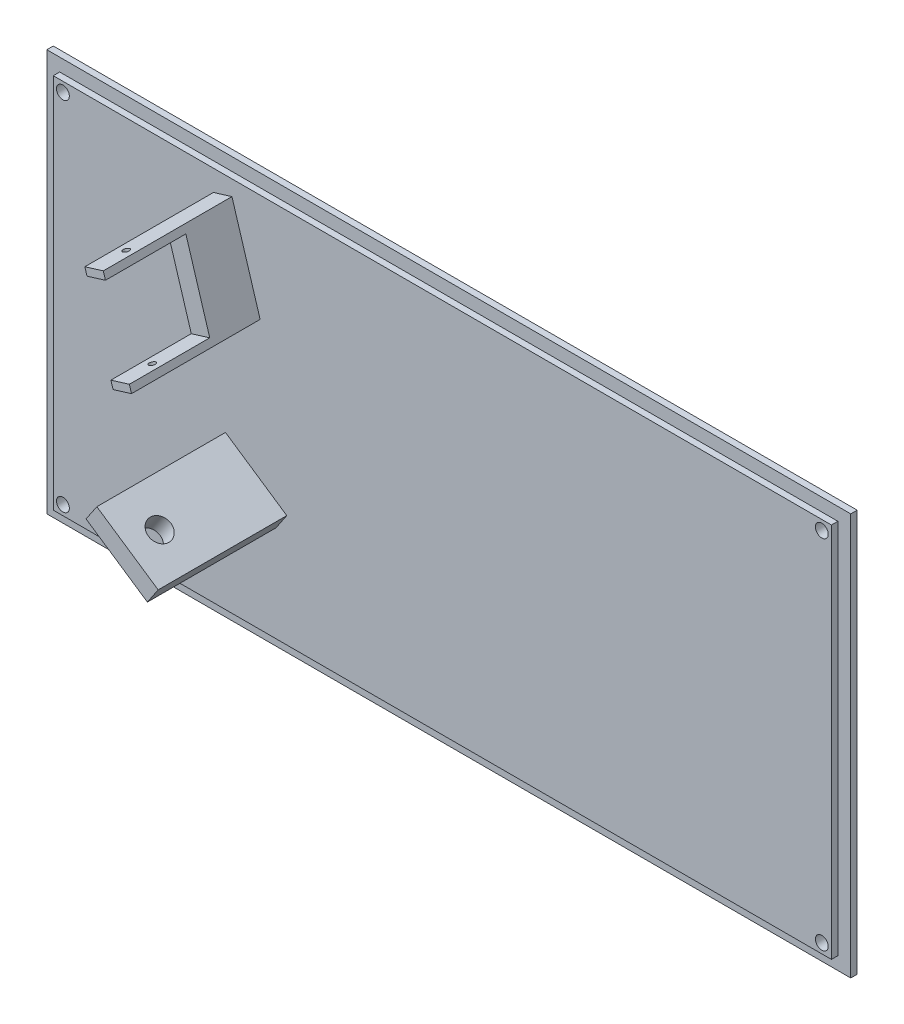
ISO-10303-21;
HEADER;
FILE_DESCRIPTION(('STEP AP214'),'2;1');
FILE_NAME('part.step','',(''),(''),'','','');
FILE_SCHEMA(('AUTOMOTIVE_DESIGN { 1 0 10303 214 1 1 1 1 }'));
ENDSEC;
DATA;
#1=APPLICATION_CONTEXT('core data for automotive mechanical design processes');
#2=APPLICATION_PROTOCOL_DEFINITION('international standard','automotive_design',2000,#1);
#3=PRODUCT_CONTEXT('',#1,'mechanical');
#4=PRODUCT('Part','Part','',(#3));
#5=PRODUCT_RELATED_PRODUCT_CATEGORY('part','',(#4));
#6=PRODUCT_DEFINITION_FORMATION('','',#4);
#7=PRODUCT_DEFINITION_CONTEXT('part definition',#1,'design');
#8=PRODUCT_DEFINITION('design','',#6,#7);
#9=PRODUCT_DEFINITION_SHAPE('','',#8);
#10=(LENGTH_UNIT() NAMED_UNIT(*) SI_UNIT(.MILLI.,.METRE.));
#11=(NAMED_UNIT(*) PLANE_ANGLE_UNIT() SI_UNIT($,.RADIAN.));
#12=(NAMED_UNIT(*) SI_UNIT($,.STERADIAN.) SOLID_ANGLE_UNIT());
#13=UNCERTAINTY_MEASURE_WITH_UNIT(LENGTH_MEASURE(1.E-05),#10,'distance_accuracy_value','');
#14=(GEOMETRIC_REPRESENTATION_CONTEXT(3) GLOBAL_UNCERTAINTY_ASSIGNED_CONTEXT((#13)) GLOBAL_UNIT_ASSIGNED_CONTEXT((#10,
#11,#12)) REPRESENTATION_CONTEXT('',''));
#15=CARTESIAN_POINT('',(0.,0.,0.));
#16=DIRECTION('',(0.,0.,1.));
#17=DIRECTION('',(1.,0.,0.));
#18=AXIS2_PLACEMENT_3D('',#15,#16,#17);
#19=CARTESIAN_POINT('',(0.,0.,44.));
#20=DIRECTION('',(0.,0.,-1.));
#21=DIRECTION('',(-1.,0.,0.));
#22=AXIS2_PLACEMENT_3D('',#19,#20,#21);
#23=PLANE('',#22);
#24=DIRECTION('',(0.292371704722737,-0.956304755963035,0.));
#25=VECTOR('',#24,1.);
#26=CARTESIAN_POINT('',(62.5952585906923,85.7783135463862,44.));
#27=LINE('',#26,#25);
#28=CARTESIAN_POINT('',(53.8241074490102,114.467456225277,44.));
#29=VERTEX_POINT('',#28);
#30=CARTESIAN_POINT('',(54.4965623698724,112.267955286562,44.));
#31=VERTEX_POINT('',#30);
#32=EDGE_CURVE('E227',#29,#31,#27,.T.);
#33=ORIENTED_EDGE('',*,*,#32,.T.);
#34=DIRECTION('',(-0.956304755963035,-0.292371704722738,0.));
#35=VECTOR('',#34,1.);
#36=CARTESIAN_POINT('',(54.4965623698724,112.267955286562,44.));
#37=LINE('',#36,#35);
#38=CARTESIAN_POINT('',(60.2343909056507,114.022185514899,44.));
#39=VERTEX_POINT('',#38);
#40=EDGE_CURVE('E186',#39,#31,#37,.T.);
#41=ORIENTED_EDGE('',*,*,#40,.F.);
#42=DIRECTION('',(-0.292371704722737,0.956304755963035,0.));
#43=VECTOR('',#42,1.);
#44=CARTESIAN_POINT('',(68.3330871264705,87.5325437747227,44.));
#45=LINE('',#44,#43);
#46=CARTESIAN_POINT('',(59.5619359847884,116.221686453614,44.));
#47=VERTEX_POINT('',#46);
#48=EDGE_CURVE('E232',#39,#47,#45,.T.);
#49=ORIENTED_EDGE('',*,*,#48,.T.);
#50=DIRECTION('',(-0.956304755963035,-0.292371704722737,0.));
#51=VECTOR('',#50,1.);
#52=CARTESIAN_POINT('',(53.8241074490102,114.467456225277,44.));
#53=LINE('',#52,#51);
#54=EDGE_CURVE('E236',#47,#29,#53,.T.);
#55=ORIENTED_EDGE('',*,*,#54,.T.);
#56=EDGE_LOOP('',(#33,#41,#49,#55));
#57=FACE_BOUND('',#56,.T.);
#58=ADVANCED_FACE('F33',(#57),#23,.F.);
#59=CARTESIAN_POINT('',(0.,0.,4.));
#60=DIRECTION('',(0.,0.,1.));
#61=DIRECTION('',(1.,0.,0.));
#62=AXIS2_PLACEMENT_3D('',#59,#60,#61);
#63=PLANE('',#62);
#64=CARTESIAN_POINT('',(243.,118.,4.));
#65=DIRECTION('',(0.,0.,1.));
#66=DIRECTION('',(1.,0.,0.));
#67=AXIS2_PLACEMENT_3D('',#64,#65,#66);
#68=CIRCLE('',#67,2.);
#69=CARTESIAN_POINT('',(245.,118.,4.));
#70=VERTEX_POINT('',#69);
#71=EDGE_CURVE('E257',#70,#70,#68,.T.);
#72=ORIENTED_EDGE('',*,*,#71,.F.);
#73=EDGE_LOOP('',(#72));
#74=FACE_BOUND('',#73,.T.);
#75=CARTESIAN_POINT('',(243.,7.,4.));
#76=DIRECTION('',(0.,0.,1.));
#77=DIRECTION('',(1.,0.,0.));
#78=AXIS2_PLACEMENT_3D('',#75,#76,#77);
#79=CIRCLE('',#78,2.);
#80=CARTESIAN_POINT('',(245.,7.,4.));
#81=VERTEX_POINT('',#80);
#82=EDGE_CURVE('E262',#81,#81,#79,.T.);
#83=ORIENTED_EDGE('',*,*,#82,.F.);
#84=EDGE_LOOP('',(#83));
#85=FACE_BOUND('',#84,.T.);
#86=CARTESIAN_POINT('',(7.,7.00000000000001,4.));
#87=DIRECTION('',(0.,0.,1.));
#88=DIRECTION('',(1.,0.,0.));
#89=AXIS2_PLACEMENT_3D('',#86,#87,#88);
#90=CIRCLE('',#89,2.);
#91=CARTESIAN_POINT('',(9.,7.00000000000001,4.));
#92=VERTEX_POINT('',#91);
#93=EDGE_CURVE('E258',#92,#92,#90,.T.);
#94=ORIENTED_EDGE('',*,*,#93,.F.);
#95=EDGE_LOOP('',(#94));
#96=FACE_BOUND('',#95,.T.);
#97=CARTESIAN_POINT('',(7.,118.,4.));
#98=DIRECTION('',(0.,0.,1.));
#99=DIRECTION('',(1.,0.,0.));
#100=AXIS2_PLACEMENT_3D('',#97,#98,#99);
#101=CIRCLE('',#100,2.);
#102=CARTESIAN_POINT('',(9.,118.,4.));
#103=VERTEX_POINT('',#102);
#104=EDGE_CURVE('E261',#103,#103,#101,.T.);
#105=ORIENTED_EDGE('',*,*,#104,.F.);
#106=EDGE_LOOP('',(#105));
#107=FACE_BOUND('',#106,.T.);
#108=DIRECTION('',(0.,-1.,0.));
#109=VECTOR('',#108,1.);
#110=CARTESIAN_POINT('',(4.,121.,4.));
#111=LINE('',#110,#109);
#112=CARTESIAN_POINT('',(4.,121.,4.));
#113=VERTEX_POINT('',#112);
#114=CARTESIAN_POINT('',(4.00000000000002,4.,4.));
#115=VERTEX_POINT('',#114);
#116=EDGE_CURVE('E282',#113,#115,#111,.T.);
#117=ORIENTED_EDGE('',*,*,#116,.T.);
#118=DIRECTION('',(1.,0.,0.));
#119=VECTOR('',#118,1.);
#120=CARTESIAN_POINT('',(4.00000000000002,4.,4.));
#121=LINE('',#120,#119);
#122=CARTESIAN_POINT('',(246.,4.,4.));
#123=VERTEX_POINT('',#122);
#124=EDGE_CURVE('E285',#115,#123,#121,.T.);
#125=ORIENTED_EDGE('',*,*,#124,.T.);
#126=DIRECTION('',(0.,1.,0.));
#127=VECTOR('',#126,1.);
#128=CARTESIAN_POINT('',(246.,121.,4.));
#129=LINE('',#128,#127);
#130=CARTESIAN_POINT('',(246.,121.,4.));
#131=VERTEX_POINT('',#130);
#132=EDGE_CURVE('E288',#123,#131,#129,.T.);
#133=ORIENTED_EDGE('',*,*,#132,.T.);
#134=DIRECTION('',(-1.,0.,0.));
#135=VECTOR('',#134,1.);
#136=CARTESIAN_POINT('',(4.,121.,4.));
#137=LINE('',#136,#135);
#138=EDGE_CURVE('E290',#131,#113,#137,.T.);
#139=ORIENTED_EDGE('',*,*,#138,.T.);
#140=EDGE_LOOP('',(#117,#125,#133,#139));
#141=FACE_BOUND('',#140,.T.);
#142=DIRECTION('',(0.956304755963035,0.292371704722738,0.));
#143=VECTOR('',#142,1.);
#144=CARTESIAN_POINT('',(62.5952585906923,85.7783135463862,4.));
#145=LINE('',#144,#143);
#146=CARTESIAN_POINT('',(62.5952585906923,85.7783135463862,4.));
#147=VERTEX_POINT('',#146);
#148=CARTESIAN_POINT('',(68.3330871264705,87.5325437747227,4.));
#149=VERTEX_POINT('',#148);
#150=EDGE_CURVE('E241',#147,#149,#145,.T.);
#151=ORIENTED_EDGE('',*,*,#150,.F.);
#152=DIRECTION('',(0.292371704722737,-0.956304755963035,0.));
#153=VECTOR('',#152,1.);
#154=CARTESIAN_POINT('',(62.5952585906923,85.7783135463862,4.));
#155=LINE('',#154,#153);
#156=CARTESIAN_POINT('',(53.8241074490102,114.467456225277,4.));
#157=VERTEX_POINT('',#156);
#158=EDGE_CURVE('E226',#157,#147,#155,.T.);
#159=ORIENTED_EDGE('',*,*,#158,.F.);
#160=DIRECTION('',(-0.956304755963035,-0.292371704722737,0.));
#161=VECTOR('',#160,1.);
#162=CARTESIAN_POINT('',(53.8241074490102,114.467456225277,4.));
#163=LINE('',#162,#161);
#164=CARTESIAN_POINT('',(59.5619359847884,116.221686453614,4.));
#165=VERTEX_POINT('',#164);
#166=EDGE_CURVE('E246',#165,#157,#163,.T.);
#167=ORIENTED_EDGE('',*,*,#166,.F.);
#168=DIRECTION('',(-0.292371704722737,0.956304755963035,0.));
#169=VECTOR('',#168,1.);
#170=CARTESIAN_POINT('',(68.3330871264705,87.5325437747227,4.));
#171=LINE('',#170,#169);
#172=EDGE_CURVE('E243',#149,#165,#171,.T.);
#173=ORIENTED_EDGE('',*,*,#172,.F.);
#174=EDGE_LOOP('',(#151,#159,#167,#173));
#175=FACE_BOUND('',#174,.T.);
#176=DIRECTION('',(0.829037572555041,-0.559192903470748,0.));
#177=VECTOR('',#176,1.);
#178=CARTESIAN_POINT('',(54.2005600012169,46.7325639564784,4.));
#179=LINE('',#178,#177);
#180=CARTESIAN_POINT('',(54.2005600012169,46.7325639564784,4.));
#181=VERTEX_POINT('',#180);
#182=CARTESIAN_POINT('',(73.2684241699829,33.8711271766512,4.));
#183=VERTEX_POINT('',#182);
#184=EDGE_CURVE('E212',#181,#183,#179,.T.);
#185=ORIENTED_EDGE('',*,*,#184,.F.);
#186=DIRECTION('',(-0.559192903470748,-0.829037572555041,0.));
#187=VECTOR('',#186,1.);
#188=CARTESIAN_POINT('',(54.2005600012169,46.7325639564784,4.));
#189=LINE('',#188,#187);
#190=CARTESIAN_POINT('',(57.5557174220414,51.7067893918087,4.));
#191=VERTEX_POINT('',#190);
#192=EDGE_CURVE('E209',#191,#181,#189,.T.);
#193=ORIENTED_EDGE('',*,*,#192,.F.);
#194=DIRECTION('',(-0.829037572555042,0.559192903470747,0.));
#195=VECTOR('',#194,1.);
#196=CARTESIAN_POINT('',(57.5557174220414,51.7067893918087,4.));
#197=LINE('',#196,#195);
#198=CARTESIAN_POINT('',(76.6235815908073,38.8453526119815,4.));
#199=VERTEX_POINT('',#198);
#200=EDGE_CURVE('E202',#199,#191,#197,.T.);
#201=ORIENTED_EDGE('',*,*,#200,.F.);
#202=DIRECTION('',(0.559192903470746,0.829037572555042,0.));
#203=VECTOR('',#202,1.);
#204=CARTESIAN_POINT('',(73.2684241699829,33.8711271766512,4.));
#205=LINE('',#204,#203);
#206=EDGE_CURVE('E215',#183,#199,#205,.T.);
#207=ORIENTED_EDGE('',*,*,#206,.F.);
#208=EDGE_LOOP('',(#185,#193,#201,#207));
#209=FACE_BOUND('',#208,.T.);
#210=ADVANCED_FACE('F363',(#74,#85,#96,#107,#141,#175,#209),#63,.T.);
#211=CARTESIAN_POINT('',(0.,0.,2.));
#212=DIRECTION('',(0.,0.,-1.));
#213=DIRECTION('',(-1.,0.,0.));
#214=AXIS2_PLACEMENT_3D('',#211,#212,#213);
#215=PLANE('',#214);
#216=DIRECTION('',(1.,0.,0.));
#217=VECTOR('',#216,1.);
#218=CARTESIAN_POINT('',(0.,0.,2.));
#219=LINE('',#218,#217);
#220=CARTESIAN_POINT('',(0.,0.,2.));
#221=VERTEX_POINT('',#220);
#222=CARTESIAN_POINT('',(250.,0.,2.));
#223=VERTEX_POINT('',#222);
#224=EDGE_CURVE('E315',#221,#223,#219,.T.);
#225=ORIENTED_EDGE('',*,*,#224,.T.);
#226=DIRECTION('',(0.,-1.,0.));
#227=VECTOR('',#226,1.);
#228=CARTESIAN_POINT('',(250.,125.,2.));
#229=LINE('',#228,#227);
#230=CARTESIAN_POINT('',(250.,125.,2.));
#231=VERTEX_POINT('',#230);
#232=EDGE_CURVE('E317',#231,#223,#229,.T.);
#233=ORIENTED_EDGE('',*,*,#232,.F.);
#234=DIRECTION('',(1.,0.,0.));
#235=VECTOR('',#234,1.);
#236=CARTESIAN_POINT('',(0.,125.,2.));
#237=LINE('',#236,#235);
#238=CARTESIAN_POINT('',(0.,125.,2.));
#239=VERTEX_POINT('',#238);
#240=EDGE_CURVE('E321',#239,#231,#237,.T.);
#241=ORIENTED_EDGE('',*,*,#240,.F.);
#242=DIRECTION('',(0.,-1.,0.));
#243=VECTOR('',#242,1.);
#244=CARTESIAN_POINT('',(0.,125.,2.));
#245=LINE('',#244,#243);
#246=EDGE_CURVE('E324',#239,#221,#245,.T.);
#247=ORIENTED_EDGE('',*,*,#246,.T.);
#248=EDGE_LOOP('',(#225,#233,#241,#247));
#249=FACE_BOUND('',#248,.T.);
#250=DIRECTION('',(0.,-1.,0.));
#251=VECTOR('',#250,1.);
#252=CARTESIAN_POINT('',(4.,121.,2.));
#253=LINE('',#252,#251);
#254=CARTESIAN_POINT('',(4.,121.,2.));
#255=VERTEX_POINT('',#254);
#256=CARTESIAN_POINT('',(4.00000000000002,4.,2.));
#257=VERTEX_POINT('',#256);
#258=EDGE_CURVE('E281',#255,#257,#253,.T.);
#259=ORIENTED_EDGE('',*,*,#258,.F.);
#260=DIRECTION('',(-1.,0.,0.));
#261=VECTOR('',#260,1.);
#262=CARTESIAN_POINT('',(4.,121.,2.));
#263=LINE('',#262,#261);
#264=CARTESIAN_POINT('',(246.,121.,2.));
#265=VERTEX_POINT('',#264);
#266=EDGE_CURVE('E286',#265,#255,#263,.T.);
#267=ORIENTED_EDGE('',*,*,#266,.F.);
#268=DIRECTION('',(0.,1.,0.));
#269=VECTOR('',#268,1.);
#270=CARTESIAN_POINT('',(246.,121.,2.));
#271=LINE('',#270,#269);
#272=CARTESIAN_POINT('',(246.,4.,2.));
#273=VERTEX_POINT('',#272);
#274=EDGE_CURVE('E298',#273,#265,#271,.T.);
#275=ORIENTED_EDGE('',*,*,#274,.F.);
#276=DIRECTION('',(1.,0.,0.));
#277=VECTOR('',#276,1.);
#278=CARTESIAN_POINT('',(4.00000000000002,4.,2.));
#279=LINE('',#278,#277);
#280=EDGE_CURVE('E295',#257,#273,#279,.T.);
#281=ORIENTED_EDGE('',*,*,#280,.F.);
#282=EDGE_LOOP('',(#259,#267,#275,#281));
#283=FACE_BOUND('',#282,.T.);
#284=ADVANCED_FACE('F360',(#249,#283),#215,.F.);
#285=CARTESIAN_POINT('',(0.,0.,2.));
#286=DIRECTION('',(0.,1.,0.));
#287=DIRECTION('',(0.,0.,1.));
#288=AXIS2_PLACEMENT_3D('',#285,#286,#287);
#289=PLANE('',#288);
#290=DIRECTION('',(1.,0.,0.));
#291=VECTOR('',#290,1.);
#292=CARTESIAN_POINT('',(0.,0.,0.));
#293=LINE('',#292,#291);
#294=CARTESIAN_POINT('',(0.,0.,0.));
#295=VERTEX_POINT('',#294);
#296=CARTESIAN_POINT('',(250.,0.,0.));
#297=VERTEX_POINT('',#296);
#298=EDGE_CURVE('E314',#295,#297,#293,.T.);
#299=ORIENTED_EDGE('',*,*,#298,.T.);
#300=DIRECTION('',(0.,0.,-1.));
#301=VECTOR('',#300,1.);
#302=CARTESIAN_POINT('',(250.,0.,2.));
#303=LINE('',#302,#301);
#304=EDGE_CURVE('E11',#223,#297,#303,.T.);
#305=ORIENTED_EDGE('',*,*,#304,.F.);
#306=ORIENTED_EDGE('',*,*,#224,.F.);
#307=DIRECTION('',(0.,0.,-1.));
#308=VECTOR('',#307,1.);
#309=CARTESIAN_POINT('',(0.,0.,2.));
#310=LINE('',#309,#308);
#311=EDGE_CURVE('E326',#221,#295,#310,.T.);
#312=ORIENTED_EDGE('',*,*,#311,.T.);
#313=EDGE_LOOP('',(#299,#305,#306,#312));
#314=FACE_BOUND('',#313,.T.);
#315=ADVANCED_FACE('F35',(#314),#289,.F.);
#316=CARTESIAN_POINT('',(250.,125.,2.));
#317=DIRECTION('',(1.,0.,0.));
#318=DIRECTION('',(0.,0.,-1.));
#319=AXIS2_PLACEMENT_3D('',#316,#317,#318);
#320=PLANE('',#319);
#321=DIRECTION('',(0.,-1.,0.));
#322=VECTOR('',#321,1.);
#323=CARTESIAN_POINT('',(250.,125.,0.));
#324=LINE('',#323,#322);
#325=CARTESIAN_POINT('',(250.,125.,0.));
#326=VERTEX_POINT('',#325);
#327=EDGE_CURVE('E329',#326,#297,#324,.T.);
#328=ORIENTED_EDGE('',*,*,#327,.F.);
#329=DIRECTION('',(0.,0.,-1.));
#330=VECTOR('',#329,1.);
#331=CARTESIAN_POINT('',(250.,125.,2.));
#332=LINE('',#331,#330);
#333=EDGE_CURVE('E42',#231,#326,#332,.T.);
#334=ORIENTED_EDGE('',*,*,#333,.F.);
#335=ORIENTED_EDGE('',*,*,#232,.T.);
#336=ORIENTED_EDGE('',*,*,#304,.T.);
#337=EDGE_LOOP('',(#328,#334,#335,#336));
#338=FACE_BOUND('',#337,.T.);
#339=ADVANCED_FACE('F347',(#338),#320,.T.);
#340=CARTESIAN_POINT('',(0.,125.,2.));
#341=DIRECTION('',(0.,1.,0.));
#342=DIRECTION('',(-1.,0.,0.));
#343=AXIS2_PLACEMENT_3D('',#340,#341,#342);
#344=PLANE('',#343);
#345=DIRECTION('',(1.,0.,0.));
#346=VECTOR('',#345,1.);
#347=CARTESIAN_POINT('',(0.,125.,0.));
#348=LINE('',#347,#346);
#349=CARTESIAN_POINT('',(0.,125.,0.));
#350=VERTEX_POINT('',#349);
#351=EDGE_CURVE('E332',#350,#326,#348,.T.);
#352=ORIENTED_EDGE('',*,*,#351,.F.);
#353=DIRECTION('',(0.,0.,-1.));
#354=VECTOR('',#353,1.);
#355=CARTESIAN_POINT('',(0.,125.,2.));
#356=LINE('',#355,#354);
#357=EDGE_CURVE('E338',#239,#350,#356,.T.);
#358=ORIENTED_EDGE('',*,*,#357,.F.);
#359=ORIENTED_EDGE('',*,*,#240,.T.);
#360=ORIENTED_EDGE('',*,*,#333,.T.);
#361=EDGE_LOOP('',(#352,#358,#359,#360));
#362=FACE_BOUND('',#361,.T.);
#363=ADVANCED_FACE('F343',(#362),#344,.T.);
#364=CARTESIAN_POINT('',(0.,125.,2.));
#365=DIRECTION('',(1.,0.,0.));
#366=DIRECTION('',(0.,0.,-1.));
#367=AXIS2_PLACEMENT_3D('',#364,#365,#366);
#368=PLANE('',#367);
#369=DIRECTION('',(0.,-1.,0.));
#370=VECTOR('',#369,1.);
#371=CARTESIAN_POINT('',(0.,125.,0.));
#372=LINE('',#371,#370);
#373=EDGE_CURVE('E318',#350,#295,#372,.T.);
#374=ORIENTED_EDGE('',*,*,#373,.T.);
#375=ORIENTED_EDGE('',*,*,#311,.F.);
#376=ORIENTED_EDGE('',*,*,#246,.F.);
#377=ORIENTED_EDGE('',*,*,#357,.T.);
#378=EDGE_LOOP('',(#374,#375,#376,#377));
#379=FACE_BOUND('',#378,.T.);
#380=ADVANCED_FACE('F355',(#379),#368,.F.);
#381=CARTESIAN_POINT('',(0.,0.,0.));
#382=DIRECTION('',(0.,0.,-1.));
#383=DIRECTION('',(-1.,0.,0.));
#384=AXIS2_PLACEMENT_3D('',#381,#382,#383);
#385=PLANE('',#384);
#386=CARTESIAN_POINT('',(243.,118.,0.));
#387=DIRECTION('',(0.,0.,-1.));
#388=DIRECTION('',(-1.,0.,0.));
#389=AXIS2_PLACEMENT_3D('',#386,#387,#388);
#390=CIRCLE('',#389,2.);
#391=CARTESIAN_POINT('',(241.,118.,0.));
#392=VERTEX_POINT('',#391);
#393=EDGE_CURVE('E278',#392,#392,#390,.T.);
#394=ORIENTED_EDGE('',*,*,#393,.F.);
#395=EDGE_LOOP('',(#394));
#396=FACE_BOUND('',#395,.T.);
#397=CARTESIAN_POINT('',(243.,7.,0.));
#398=DIRECTION('',(0.,0.,-1.));
#399=DIRECTION('',(-1.,0.,0.));
#400=AXIS2_PLACEMENT_3D('',#397,#398,#399);
#401=CIRCLE('',#400,2.);
#402=CARTESIAN_POINT('',(241.,7.,0.));
#403=VERTEX_POINT('',#402);
#404=EDGE_CURVE('E275',#403,#403,#401,.T.);
#405=ORIENTED_EDGE('',*,*,#404,.F.);
#406=EDGE_LOOP('',(#405));
#407=FACE_BOUND('',#406,.T.);
#408=CARTESIAN_POINT('',(7.,7.00000000000001,0.));
#409=DIRECTION('',(0.,0.,-1.));
#410=DIRECTION('',(-1.,0.,0.));
#411=AXIS2_PLACEMENT_3D('',#408,#409,#410);
#412=CIRCLE('',#411,2.);
#413=CARTESIAN_POINT('',(5.,7.00000000000001,0.));
#414=VERTEX_POINT('',#413);
#415=EDGE_CURVE('E272',#414,#414,#412,.T.);
#416=ORIENTED_EDGE('',*,*,#415,.F.);
#417=EDGE_LOOP('',(#416));
#418=FACE_BOUND('',#417,.T.);
#419=CARTESIAN_POINT('',(7.,118.,0.));
#420=DIRECTION('',(0.,0.,-1.));
#421=DIRECTION('',(-1.,0.,0.));
#422=AXIS2_PLACEMENT_3D('',#419,#420,#421);
#423=CIRCLE('',#422,2.);
#424=CARTESIAN_POINT('',(5.,118.,0.));
#425=VERTEX_POINT('',#424);
#426=EDGE_CURVE('E269',#425,#425,#423,.T.);
#427=ORIENTED_EDGE('',*,*,#426,.F.);
#428=EDGE_LOOP('',(#427));
#429=FACE_BOUND('',#428,.T.);
#430=ORIENTED_EDGE('',*,*,#298,.F.);
#431=ORIENTED_EDGE('',*,*,#373,.F.);
#432=ORIENTED_EDGE('',*,*,#351,.T.);
#433=ORIENTED_EDGE('',*,*,#327,.T.);
#434=EDGE_LOOP('',(#430,#431,#432,#433));
#435=FACE_BOUND('',#434,.T.);
#436=ADVANCED_FACE('F352',(#396,#407,#418,#429,#435),#385,.T.);
#437=CARTESIAN_POINT('',(4.,121.,4.));
#438=DIRECTION('',(1.,0.,0.));
#439=DIRECTION('',(0.,1.,0.));
#440=AXIS2_PLACEMENT_3D('',#437,#438,#439);
#441=PLANE('',#440);
#442=ORIENTED_EDGE('',*,*,#258,.T.);
#443=DIRECTION('',(0.,0.,-1.));
#444=VECTOR('',#443,1.);
#445=CARTESIAN_POINT('',(4.00000000000002,4.,4.));
#446=LINE('',#445,#444);
#447=EDGE_CURVE('E311',#115,#257,#446,.T.);
#448=ORIENTED_EDGE('',*,*,#447,.F.);
#449=ORIENTED_EDGE('',*,*,#116,.F.);
#450=DIRECTION('',(0.,0.,-1.));
#451=VECTOR('',#450,1.);
#452=CARTESIAN_POINT('',(4.,121.,4.));
#453=LINE('',#452,#451);
#454=EDGE_CURVE('E292',#113,#255,#453,.T.);
#455=ORIENTED_EDGE('',*,*,#454,.T.);
#456=EDGE_LOOP('',(#442,#448,#449,#455));
#457=FACE_BOUND('',#456,.T.);
#458=ADVANCED_FACE('F373',(#457),#441,.F.);
#459=CARTESIAN_POINT('',(4.00000000000002,4.,4.));
#460=DIRECTION('',(0.,1.,0.));
#461=DIRECTION('',(0.,0.,1.));
#462=AXIS2_PLACEMENT_3D('',#459,#460,#461);
#463=PLANE('',#462);
#464=ORIENTED_EDGE('',*,*,#280,.T.);
#465=DIRECTION('',(0.,0.,-1.));
#466=VECTOR('',#465,1.);
#467=CARTESIAN_POINT('',(246.,4.,4.));
#468=LINE('',#467,#466);
#469=EDGE_CURVE('E308',#123,#273,#468,.T.);
#470=ORIENTED_EDGE('',*,*,#469,.F.);
#471=ORIENTED_EDGE('',*,*,#124,.F.);
#472=ORIENTED_EDGE('',*,*,#447,.T.);
#473=EDGE_LOOP('',(#464,#470,#471,#472));
#474=FACE_BOUND('',#473,.T.);
#475=ADVANCED_FACE('F381',(#474),#463,.F.);
#476=CARTESIAN_POINT('',(246.,121.,4.));
#477=DIRECTION('',(-1.,0.,0.));
#478=DIRECTION('',(0.,-1.,0.));
#479=AXIS2_PLACEMENT_3D('',#476,#477,#478);
#480=PLANE('',#479);
#481=ORIENTED_EDGE('',*,*,#274,.T.);
#482=DIRECTION('',(0.,0.,-1.));
#483=VECTOR('',#482,1.);
#484=CARTESIAN_POINT('',(246.,121.,4.));
#485=LINE('',#484,#483);
#486=EDGE_CURVE('E305',#131,#265,#485,.T.);
#487=ORIENTED_EDGE('',*,*,#486,.F.);
#488=ORIENTED_EDGE('',*,*,#132,.F.);
#489=ORIENTED_EDGE('',*,*,#469,.T.);
#490=EDGE_LOOP('',(#481,#487,#488,#489));
#491=FACE_BOUND('',#490,.T.);
#492=ADVANCED_FACE('F379',(#491),#480,.F.);
#493=CARTESIAN_POINT('',(4.,121.,4.));
#494=DIRECTION('',(0.,-1.,0.));
#495=DIRECTION('',(0.,0.,-1.));
#496=AXIS2_PLACEMENT_3D('',#493,#494,#495);
#497=PLANE('',#496);
#498=ORIENTED_EDGE('',*,*,#266,.T.);
#499=ORIENTED_EDGE('',*,*,#454,.F.);
#500=ORIENTED_EDGE('',*,*,#138,.F.);
#501=ORIENTED_EDGE('',*,*,#486,.T.);
#502=EDGE_LOOP('',(#498,#499,#500,#501));
#503=FACE_BOUND('',#502,.T.);
#504=ADVANCED_FACE('F369',(#503),#497,.F.);
#505=CARTESIAN_POINT('',(7.,118.,-28.));
#506=DIRECTION('',(0.,0.,1.));
#507=DIRECTION('',(1.,0.,0.));
#508=AXIS2_PLACEMENT_3D('',#505,#506,#507);
#509=CYLINDRICAL_SURFACE('',#508,2.);
#510=ORIENTED_EDGE('',*,*,#426,.T.);
#511=EDGE_LOOP('',(#510));
#512=FACE_BOUND('',#511,.T.);
#513=ORIENTED_EDGE('',*,*,#104,.T.);
#514=EDGE_LOOP('',(#513));
#515=FACE_BOUND('',#514,.T.);
#516=ADVANCED_FACE('F458',(#512,#515),#509,.F.);
#517=CARTESIAN_POINT('',(7.,7.00000000000001,-28.));
#518=DIRECTION('',(0.,0.,1.));
#519=DIRECTION('',(1.,0.,0.));
#520=AXIS2_PLACEMENT_3D('',#517,#518,#519);
#521=CYLINDRICAL_SURFACE('',#520,2.);
#522=ORIENTED_EDGE('',*,*,#415,.T.);
#523=EDGE_LOOP('',(#522));
#524=FACE_BOUND('',#523,.T.);
#525=ORIENTED_EDGE('',*,*,#93,.T.);
#526=EDGE_LOOP('',(#525));
#527=FACE_BOUND('',#526,.T.);
#528=ADVANCED_FACE('F454',(#524,#527),#521,.F.);
#529=CARTESIAN_POINT('',(243.,7.,-28.));
#530=DIRECTION('',(0.,0.,1.));
#531=DIRECTION('',(1.,0.,0.));
#532=AXIS2_PLACEMENT_3D('',#529,#530,#531);
#533=CYLINDRICAL_SURFACE('',#532,2.);
#534=ORIENTED_EDGE('',*,*,#404,.T.);
#535=EDGE_LOOP('',(#534));
#536=FACE_BOUND('',#535,.T.);
#537=ORIENTED_EDGE('',*,*,#82,.T.);
#538=EDGE_LOOP('',(#537));
#539=FACE_BOUND('',#538,.T.);
#540=ADVANCED_FACE('F457',(#536,#539),#533,.F.);
#541=CARTESIAN_POINT('',(243.,118.,-28.));
#542=DIRECTION('',(0.,0.,1.));
#543=DIRECTION('',(1.,0.,0.));
#544=AXIS2_PLACEMENT_3D('',#541,#542,#543);
#545=CYLINDRICAL_SURFACE('',#544,2.);
#546=ORIENTED_EDGE('',*,*,#393,.T.);
#547=EDGE_LOOP('',(#546));
#548=FACE_BOUND('',#547,.T.);
#549=ORIENTED_EDGE('',*,*,#71,.T.);
#550=EDGE_LOOP('',(#549));
#551=FACE_BOUND('',#550,.T.);
#552=ADVANCED_FACE('F450',(#548,#551),#545,.F.);
#553=CARTESIAN_POINT('',(62.5952585906923,85.7783135463862,44.));
#554=DIRECTION('',(0.956304755963035,0.292371704722737,0.));
#555=DIRECTION('',(-0.292371704722737,0.956304755963035,0.));
#556=AXIS2_PLACEMENT_3D('',#553,#554,#555);
#557=PLANE('',#556);
#558=DIRECTION('',(0.292371704722739,-0.956304755963035,0.));
#559=VECTOR('',#558,1.);
#560=CARTESIAN_POINT('',(54.4965623698724,112.267955286562,19.));
#561=LINE('',#560,#559);
#562=CARTESIAN_POINT('',(54.4965623698724,112.267955286562,19.));
#563=VERTEX_POINT('',#562);
#564=CARTESIAN_POINT('',(61.92280366983,87.9778144851012,19.));
#565=VERTEX_POINT('',#564);
#566=EDGE_CURVE('E177',#563,#565,#561,.T.);
#567=ORIENTED_EDGE('',*,*,#566,.F.);
#568=DIRECTION('',(0.,0.,1.));
#569=VECTOR('',#568,1.);
#570=CARTESIAN_POINT('',(54.4965623698724,112.267955286562,19.));
#571=LINE('',#570,#569);
#572=EDGE_CURVE('E213',#563,#31,#571,.T.);
#573=ORIENTED_EDGE('',*,*,#572,.T.);
#574=ORIENTED_EDGE('',*,*,#32,.F.);
#575=DIRECTION('',(0.,0.,-1.));
#576=VECTOR('',#575,1.);
#577=CARTESIAN_POINT('',(53.8241074490102,114.467456225277,44.));
#578=LINE('',#577,#576);
#579=EDGE_CURVE('E238',#29,#157,#578,.T.);
#580=ORIENTED_EDGE('',*,*,#579,.T.);
#581=ORIENTED_EDGE('',*,*,#158,.T.);
#582=DIRECTION('',(0.,0.,-1.));
#583=VECTOR('',#582,1.);
#584=CARTESIAN_POINT('',(62.5952585906923,85.7783135463862,44.));
#585=LINE('',#584,#583);
#586=CARTESIAN_POINT('',(62.5952585906923,85.7783135463862,44.));
#587=VERTEX_POINT('',#586);
#588=EDGE_CURVE('E255',#587,#147,#585,.T.);
#589=ORIENTED_EDGE('',*,*,#588,.F.);
#590=CARTESIAN_POINT('',(61.92280366983,87.9778144851012,44.));
#591=VERTEX_POINT('',#590);
#592=EDGE_CURVE('E191',#591,#587,#27,.T.);
#593=ORIENTED_EDGE('',*,*,#592,.F.);
#594=DIRECTION('',(0.,0.,1.));
#595=VECTOR('',#594,1.);
#596=CARTESIAN_POINT('',(61.92280366983,87.9778144851012,19.));
#597=LINE('',#596,#595);
#598=EDGE_CURVE('E49',#565,#591,#597,.T.);
#599=ORIENTED_EDGE('',*,*,#598,.F.);
#600=EDGE_LOOP('',(#567,#573,#574,#580,#581,#589,#593,#599));
#601=FACE_BOUND('',#600,.T.);
#602=ADVANCED_FACE('F189',(#601),#557,.F.);
#603=CARTESIAN_POINT('',(62.5952585906923,85.7783135463862,44.));
#604=DIRECTION('',(-0.292371704722738,0.956304755963035,0.));
#605=DIRECTION('',(-0.956304755963035,-0.292371704722738,0.));
#606=AXIS2_PLACEMENT_3D('',#603,#604,#605);
#607=PLANE('',#606);
#608=CARTESIAN_POINT('',(65.4641728585814,86.6554286605545,34.));
#609=DIRECTION('',(-0.292371704722738,0.956304755963035,0.));
#610=DIRECTION('',(-0.956304755963035,-0.292371704722738,0.));
#611=AXIS2_PLACEMENT_3D('',#608,#609,#610);
#612=CIRCLE('',#611,1.);
#613=CARTESIAN_POINT('',(64.5078681026184,86.3630569558317,34.));
#614=VERTEX_POINT('',#613);
#615=EDGE_CURVE('E426',#614,#614,#612,.T.);
#616=ORIENTED_EDGE('',*,*,#615,.T.);
#617=EDGE_LOOP('',(#616));
#618=FACE_BOUND('',#617,.T.);
#619=ORIENTED_EDGE('',*,*,#150,.T.);
#620=DIRECTION('',(0.,0.,-1.));
#621=VECTOR('',#620,1.);
#622=CARTESIAN_POINT('',(68.3330871264705,87.5325437747227,44.));
#623=LINE('',#622,#621);
#624=CARTESIAN_POINT('',(68.3330871264705,87.5325437747227,44.));
#625=VERTEX_POINT('',#624);
#626=EDGE_CURVE('E252',#625,#149,#623,.T.);
#627=ORIENTED_EDGE('',*,*,#626,.F.);
#628=DIRECTION('',(0.956304755963035,0.292371704722738,0.));
#629=VECTOR('',#628,1.);
#630=CARTESIAN_POINT('',(62.5952585906923,85.7783135463862,44.));
#631=LINE('',#630,#629);
#632=EDGE_CURVE('E230',#587,#625,#631,.T.);
#633=ORIENTED_EDGE('',*,*,#632,.F.);
#634=ORIENTED_EDGE('',*,*,#588,.T.);
#635=EDGE_LOOP('',(#619,#627,#633,#634));
#636=FACE_BOUND('',#635,.T.);
#637=ADVANCED_FACE('F441',(#618,#636),#607,.F.);
#638=CARTESIAN_POINT('',(68.3330871264705,87.5325437747227,44.));
#639=DIRECTION('',(-0.956304755963035,-0.292371704722737,0.));
#640=DIRECTION('',(0.292371704722737,-0.956304755963036,0.));
#641=AXIS2_PLACEMENT_3D('',#638,#639,#640);
#642=PLANE('',#641);
#643=ORIENTED_EDGE('',*,*,#48,.F.);
#644=DIRECTION('',(0.,0.,1.));
#645=VECTOR('',#644,1.);
#646=CARTESIAN_POINT('',(60.2343909056507,114.022185514899,19.));
#647=LINE('',#646,#645);
#648=CARTESIAN_POINT('',(60.2343909056507,114.022185514899,19.));
#649=VERTEX_POINT('',#648);
#650=EDGE_CURVE('E193',#649,#39,#647,.T.);
#651=ORIENTED_EDGE('',*,*,#650,.F.);
#652=DIRECTION('',(-0.292371704722737,0.956304755963036,0.));
#653=VECTOR('',#652,1.);
#654=CARTESIAN_POINT('',(60.2343909056507,114.022185514899,19.));
#655=LINE('',#654,#653);
#656=CARTESIAN_POINT('',(67.6606322056082,89.7320447134377,19.));
#657=VERTEX_POINT('',#656);
#658=EDGE_CURVE('E176',#657,#649,#655,.T.);
#659=ORIENTED_EDGE('',*,*,#658,.F.);
#660=DIRECTION('',(0.,0.,1.));
#661=VECTOR('',#660,1.);
#662=CARTESIAN_POINT('',(67.6606322056082,89.7320447134377,19.));
#663=LINE('',#662,#661);
#664=CARTESIAN_POINT('',(67.6606322056082,89.7320447134377,44.));
#665=VERTEX_POINT('',#664);
#666=EDGE_CURVE('E173',#657,#665,#663,.T.);
#667=ORIENTED_EDGE('',*,*,#666,.T.);
#668=EDGE_CURVE('E233',#625,#665,#45,.T.);
#669=ORIENTED_EDGE('',*,*,#668,.F.);
#670=ORIENTED_EDGE('',*,*,#626,.T.);
#671=ORIENTED_EDGE('',*,*,#172,.T.);
#672=DIRECTION('',(0.,0.,-1.));
#673=VECTOR('',#672,1.);
#674=CARTESIAN_POINT('',(59.5619359847884,116.221686453614,44.));
#675=LINE('',#674,#673);
#676=EDGE_CURVE('E250',#47,#165,#675,.T.);
#677=ORIENTED_EDGE('',*,*,#676,.F.);
#678=EDGE_LOOP('',(#643,#651,#659,#667,#669,#670,#671,#677));
#679=FACE_BOUND('',#678,.T.);
#680=ADVANCED_FACE('F413',(#679),#642,.F.);
#681=CARTESIAN_POINT('',(53.8241074490102,114.467456225277,44.));
#682=DIRECTION('',(0.292371704722737,-0.956304755963035,0.));
#683=DIRECTION('',(0.956304755963035,0.292371704722737,0.));
#684=AXIS2_PLACEMENT_3D('',#681,#682,#683);
#685=PLANE('',#684);
#686=CARTESIAN_POINT('',(56.6930217168992,115.344571339446,34.));
#687=DIRECTION('',(-0.292371704722738,0.956304755963035,0.));
#688=DIRECTION('',(-0.956304755963035,-0.292371704722738,0.));
#689=AXIS2_PLACEMENT_3D('',#686,#687,#688);
#690=CIRCLE('',#689,1.);
#691=CARTESIAN_POINT('',(55.7367169609362,115.052199634723,34.));
#692=VERTEX_POINT('',#691);
#693=EDGE_CURVE('E622',#692,#692,#690,.T.);
#694=ORIENTED_EDGE('',*,*,#693,.F.);
#695=EDGE_LOOP('',(#694));
#696=FACE_BOUND('',#695,.T.);
#697=ORIENTED_EDGE('',*,*,#166,.T.);
#698=ORIENTED_EDGE('',*,*,#579,.F.);
#699=ORIENTED_EDGE('',*,*,#54,.F.);
#700=ORIENTED_EDGE('',*,*,#676,.T.);
#701=EDGE_LOOP('',(#697,#698,#699,#700));
#702=FACE_BOUND('',#701,.T.);
#703=ADVANCED_FACE('F405',(#696,#702),#685,.F.);
#704=ORIENTED_EDGE('',*,*,#668,.T.);
#705=DIRECTION('',(0.956304755963036,0.292371704722736,0.));
#706=VECTOR('',#705,1.);
#707=CARTESIAN_POINT('',(61.92280366983,87.9778144851012,44.));
#708=LINE('',#707,#706);
#709=EDGE_CURVE('E416',#591,#665,#708,.T.);
#710=ORIENTED_EDGE('',*,*,#709,.F.);
#711=ORIENTED_EDGE('',*,*,#592,.T.);
#712=ORIENTED_EDGE('',*,*,#632,.T.);
#713=EDGE_LOOP('',(#704,#710,#711,#712));
#714=FACE_BOUND('',#713,.T.);
#715=ADVANCED_FACE('F393',(#714),#23,.F.);
#716=CARTESIAN_POINT('',(54.2005600012169,46.7325639564784,44.));
#717=DIRECTION('',(0.829037572555041,-0.559192903470748,0.));
#718=DIRECTION('',(0.559192903470749,0.829037572555041,0.));
#719=AXIS2_PLACEMENT_3D('',#716,#717,#718);
#720=PLANE('',#719);
#721=ORIENTED_EDGE('',*,*,#192,.T.);
#722=DIRECTION('',(0.,0.,-1.));
#723=VECTOR('',#722,1.);
#724=CARTESIAN_POINT('',(54.2005600012169,46.7325639564784,44.));
#725=LINE('',#724,#723);
#726=CARTESIAN_POINT('',(54.2005600012169,46.7325639564784,44.));
#727=VERTEX_POINT('',#726);
#728=EDGE_CURVE('E224',#727,#181,#725,.T.);
#729=ORIENTED_EDGE('',*,*,#728,.F.);
#730=DIRECTION('',(-0.559192903470748,-0.829037572555041,0.));
#731=VECTOR('',#730,1.);
#732=CARTESIAN_POINT('',(54.2005600012169,46.7325639564784,44.));
#733=LINE('',#732,#731);
#734=CARTESIAN_POINT('',(57.5557174220414,51.7067893918087,44.));
#735=VERTEX_POINT('',#734);
#736=EDGE_CURVE('E198',#735,#727,#733,.T.);
#737=ORIENTED_EDGE('',*,*,#736,.F.);
#738=DIRECTION('',(0.,0.,-1.));
#739=VECTOR('',#738,1.);
#740=CARTESIAN_POINT('',(57.5557174220414,51.7067893918087,44.));
#741=LINE('',#740,#739);
#742=EDGE_CURVE('E208',#735,#191,#741,.T.);
#743=ORIENTED_EDGE('',*,*,#742,.T.);
#744=EDGE_LOOP('',(#721,#729,#737,#743));
#745=FACE_BOUND('',#744,.T.);
#746=ADVANCED_FACE('F404',(#745),#720,.F.);
#747=CARTESIAN_POINT('',(54.2005600012169,46.7325639564784,44.));
#748=DIRECTION('',(0.559192903470748,0.829037572555041,0.));
#749=DIRECTION('',(-0.829037572555041,0.559192903470748,0.));
#750=AXIS2_PLACEMENT_3D('',#747,#748,#749);
#751=PLANE('',#750);
#752=CARTESIAN_POINT('',(63.7344920855998,40.3018455665649,34.));
#753=DIRECTION('',(0.559192903470748,0.829037572555041,0.));
#754=DIRECTION('',(-0.829037572555041,0.559192903470748,0.));
#755=AXIS2_PLACEMENT_3D('',#752,#753,#754);
#756=CIRCLE('',#755,3.49313566126821);
#757=CARTESIAN_POINT('',(60.8385513763766,42.2551822392066,34.));
#758=VERTEX_POINT('',#757);
#759=EDGE_CURVE('E621',#758,#758,#756,.T.);
#760=ORIENTED_EDGE('',*,*,#759,.T.);
#761=EDGE_LOOP('',(#760));
#762=FACE_BOUND('',#761,.T.);
#763=ORIENTED_EDGE('',*,*,#184,.T.);
#764=DIRECTION('',(0.,0.,-1.));
#765=VECTOR('',#764,1.);
#766=CARTESIAN_POINT('',(73.2684241699829,33.8711271766512,44.));
#767=LINE('',#766,#765);
#768=CARTESIAN_POINT('',(73.2684241699829,33.8711271766512,44.));
#769=VERTEX_POINT('',#768);
#770=EDGE_CURVE('E221',#769,#183,#767,.T.);
#771=ORIENTED_EDGE('',*,*,#770,.F.);
#772=DIRECTION('',(0.829037572555041,-0.559192903470748,0.));
#773=VECTOR('',#772,1.);
#774=CARTESIAN_POINT('',(54.2005600012169,46.7325639564784,44.));
#775=LINE('',#774,#773);
#776=EDGE_CURVE('E201',#727,#769,#775,.T.);
#777=ORIENTED_EDGE('',*,*,#776,.F.);
#778=ORIENTED_EDGE('',*,*,#728,.T.);
#779=EDGE_LOOP('',(#763,#771,#777,#778));
#780=FACE_BOUND('',#779,.T.);
#781=ADVANCED_FACE('F411',(#762,#780),#751,.F.);
#782=CARTESIAN_POINT('',(73.2684241699829,33.8711271766512,44.));
#783=DIRECTION('',(-0.829037572555042,0.559192903470746,0.));
#784=DIRECTION('',(-0.559192903470746,-0.829037572555042,0.));
#785=AXIS2_PLACEMENT_3D('',#782,#783,#784);
#786=PLANE('',#785);
#787=ORIENTED_EDGE('',*,*,#206,.T.);
#788=DIRECTION('',(0.,0.,-1.));
#789=VECTOR('',#788,1.);
#790=CARTESIAN_POINT('',(76.6235815908073,38.8453526119815,44.));
#791=LINE('',#790,#789);
#792=CARTESIAN_POINT('',(76.6235815908073,38.8453526119815,44.));
#793=VERTEX_POINT('',#792);
#794=EDGE_CURVE('E57',#793,#199,#791,.T.);
#795=ORIENTED_EDGE('',*,*,#794,.F.);
#796=DIRECTION('',(0.559192903470746,0.829037572555042,0.));
#797=VECTOR('',#796,1.);
#798=CARTESIAN_POINT('',(73.2684241699829,33.8711271766512,44.));
#799=LINE('',#798,#797);
#800=EDGE_CURVE('E204',#769,#793,#799,.T.);
#801=ORIENTED_EDGE('',*,*,#800,.F.);
#802=ORIENTED_EDGE('',*,*,#770,.T.);
#803=EDGE_LOOP('',(#787,#795,#801,#802));
#804=FACE_BOUND('',#803,.T.);
#805=ADVANCED_FACE('F496',(#804),#786,.F.);
#806=CARTESIAN_POINT('',(57.5557174220414,51.7067893918087,44.));
#807=DIRECTION('',(-0.559192903470747,-0.829037572555042,0.));
#808=DIRECTION('',(0.829037572555042,-0.559192903470747,0.));
#809=AXIS2_PLACEMENT_3D('',#806,#807,#808);
#810=PLANE('',#809);
#811=CARTESIAN_POINT('',(67.0896495064243,45.2760710018951,34.));
#812=DIRECTION('',(0.559192903470748,0.829037572555041,0.));
#813=DIRECTION('',(-0.829037572555041,0.559192903470748,0.));
#814=AXIS2_PLACEMENT_3D('',#811,#812,#813);
#815=CIRCLE('',#814,3.49313566126821);
#816=CARTESIAN_POINT('',(64.1937087972011,47.2294076745369,34.));
#817=VERTEX_POINT('',#816);
#818=EDGE_CURVE('E618',#817,#817,#815,.T.);
#819=ORIENTED_EDGE('',*,*,#818,.F.);
#820=EDGE_LOOP('',(#819));
#821=FACE_BOUND('',#820,.T.);
#822=ORIENTED_EDGE('',*,*,#200,.T.);
#823=ORIENTED_EDGE('',*,*,#742,.F.);
#824=DIRECTION('',(-0.829037572555042,0.559192903470747,0.));
#825=VECTOR('',#824,1.);
#826=CARTESIAN_POINT('',(57.5557174220414,51.7067893918087,44.));
#827=LINE('',#826,#825);
#828=EDGE_CURVE('E206',#793,#735,#827,.T.);
#829=ORIENTED_EDGE('',*,*,#828,.F.);
#830=ORIENTED_EDGE('',*,*,#794,.T.);
#831=EDGE_LOOP('',(#822,#823,#829,#830));
#832=FACE_BOUND('',#831,.T.);
#833=ADVANCED_FACE('F501',(#821,#832),#810,.F.);
#834=CARTESIAN_POINT('',(0.,0.,44.));
#835=DIRECTION('',(0.,0.,-1.));
#836=DIRECTION('',(-1.,0.,0.));
#837=AXIS2_PLACEMENT_3D('',#834,#835,#836);
#838=PLANE('',#837);
#839=ORIENTED_EDGE('',*,*,#736,.T.);
#840=ORIENTED_EDGE('',*,*,#776,.T.);
#841=ORIENTED_EDGE('',*,*,#800,.T.);
#842=ORIENTED_EDGE('',*,*,#828,.T.);
#843=EDGE_LOOP('',(#839,#840,#841,#842));
#844=FACE_BOUND('',#843,.T.);
#845=ADVANCED_FACE('F509',(#844),#838,.F.);
#846=CARTESIAN_POINT('',(54.4965623698724,112.267955286562,19.));
#847=DIRECTION('',(-0.292371704722738,0.956304755963035,0.));
#848=DIRECTION('',(-0.956304755963035,-0.292371704722738,0.));
#849=AXIS2_PLACEMENT_3D('',#846,#847,#848);
#850=PLANE('',#849);
#851=CARTESIAN_POINT('',(57.3654766377616,113.145070400731,34.));
#852=DIRECTION('',(-0.292371704722738,0.956304755963035,0.));
#853=DIRECTION('',(-0.956304755963035,-0.292371704722738,0.));
#854=AXIS2_PLACEMENT_3D('',#851,#852,#853);
#855=CIRCLE('',#854,1.);
#856=CARTESIAN_POINT('',(56.4091718817985,112.852698696008,34.));
#857=VERTEX_POINT('',#856);
#858=EDGE_CURVE('E628',#857,#857,#855,.T.);
#859=ORIENTED_EDGE('',*,*,#858,.T.);
#860=EDGE_LOOP('',(#859));
#861=FACE_BOUND('',#860,.T.);
#862=ORIENTED_EDGE('',*,*,#40,.T.);
#863=ORIENTED_EDGE('',*,*,#572,.F.);
#864=DIRECTION('',(-0.956304755963035,-0.292371704722738,0.));
#865=VECTOR('',#864,1.);
#866=CARTESIAN_POINT('',(54.4965623698724,112.267955286562,19.));
#867=LINE('',#866,#865);
#868=EDGE_CURVE('E183',#649,#563,#867,.T.);
#869=ORIENTED_EDGE('',*,*,#868,.F.);
#870=ORIENTED_EDGE('',*,*,#650,.T.);
#871=EDGE_LOOP('',(#862,#863,#869,#870));
#872=FACE_BOUND('',#871,.T.);
#873=ADVANCED_FACE('F430',(#861,#872),#850,.F.);
#874=CARTESIAN_POINT('',(61.92280366983,87.9778144851012,19.));
#875=DIRECTION('',(0.292371704722736,-0.956304755963036,0.));
#876=DIRECTION('',(0.956304755963036,0.292371704722736,0.));
#877=AXIS2_PLACEMENT_3D('',#874,#875,#876);
#878=PLANE('',#877);
#879=CARTESIAN_POINT('',(64.7917179377191,88.8549295992694,34.));
#880=DIRECTION('',(0.292371704722736,-0.956304755963036,0.));
#881=DIRECTION('',(0.956304755963036,0.292371704722736,0.));
#882=AXIS2_PLACEMENT_3D('',#879,#880,#881);
#883=CIRCLE('',#882,1.);
#884=CARTESIAN_POINT('',(65.7480226936821,89.1473013039922,34.));
#885=VERTEX_POINT('',#884);
#886=EDGE_CURVE('E37',#885,#885,#883,.T.);
#887=ORIENTED_EDGE('',*,*,#886,.T.);
#888=EDGE_LOOP('',(#887));
#889=FACE_BOUND('',#888,.T.);
#890=ORIENTED_EDGE('',*,*,#709,.T.);
#891=ORIENTED_EDGE('',*,*,#666,.F.);
#892=DIRECTION('',(0.956304755963036,0.292371704722736,0.));
#893=VECTOR('',#892,1.);
#894=CARTESIAN_POINT('',(61.92280366983,87.9778144851012,19.));
#895=LINE('',#894,#893);
#896=EDGE_CURVE('E169',#565,#657,#895,.T.);
#897=ORIENTED_EDGE('',*,*,#896,.F.);
#898=ORIENTED_EDGE('',*,*,#598,.T.);
#899=EDGE_LOOP('',(#890,#891,#897,#898));
#900=FACE_BOUND('',#899,.T.);
#901=ADVANCED_FACE('F171',(#889,#900),#878,.F.);
#902=CARTESIAN_POINT('',(0.,0.,19.));
#903=DIRECTION('',(0.,0.,1.));
#904=DIRECTION('',(1.,0.,0.));
#905=AXIS2_PLACEMENT_3D('',#902,#903,#904);
#906=PLANE('',#905);
#907=ORIENTED_EDGE('',*,*,#566,.T.);
#908=ORIENTED_EDGE('',*,*,#896,.T.);
#909=ORIENTED_EDGE('',*,*,#658,.T.);
#910=ORIENTED_EDGE('',*,*,#868,.T.);
#911=EDGE_LOOP('',(#907,#908,#909,#910));
#912=FACE_BOUND('',#911,.T.);
#913=ADVANCED_FACE('F181',(#912),#906,.T.);
#914=CARTESIAN_POINT('',(68.3878899058087,77.0923811009242,34.));
#915=DIRECTION('',(-0.292371704722738,0.956304755963035,0.));
#916=DIRECTION('',(-0.956304755963035,-0.292371704722738,0.));
#917=AXIS2_PLACEMENT_3D('',#914,#915,#916);
#918=CYLINDRICAL_SURFACE('',#917,1.);
#919=ORIENTED_EDGE('',*,*,#886,.F.);
#920=EDGE_LOOP('',(#919));
#921=FACE_BOUND('',#920,.T.);
#922=ORIENTED_EDGE('',*,*,#615,.F.);
#923=EDGE_LOOP('',(#922));
#924=FACE_BOUND('',#923,.T.);
#925=ADVANCED_FACE('F544',(#921,#924),#918,.F.);
#926=ORIENTED_EDGE('',*,*,#693,.T.);
#927=EDGE_LOOP('',(#926));
#928=FACE_BOUND('',#927,.T.);
#929=ORIENTED_EDGE('',*,*,#858,.F.);
#930=EDGE_LOOP('',(#929));
#931=FACE_BOUND('',#930,.T.);
#932=ADVANCED_FACE('F578',(#928,#931),#918,.F.);
#933=CARTESIAN_POINT('',(55.9057914370094,28.6953195507943,34.));
#934=DIRECTION('',(0.559192903470747,0.829037572555041,0.));
#935=DIRECTION('',(-0.829037572555041,0.559192903470748,0.));
#936=AXIS2_PLACEMENT_3D('',#933,#934,#935);
#937=CYLINDRICAL_SURFACE('',#936,3.49313566126821);
#938=ORIENTED_EDGE('',*,*,#818,.T.);
#939=EDGE_LOOP('',(#938));
#940=FACE_BOUND('',#939,.T.);
#941=ORIENTED_EDGE('',*,*,#759,.F.);
#942=EDGE_LOOP('',(#941));
#943=FACE_BOUND('',#942,.T.);
#944=ADVANCED_FACE('F588',(#940,#943),#937,.F.);
#945=CLOSED_SHELL('',(#58,#210,#284,#315,#339,#363,#380,#436,#458,#475,#492,#504,#516,#528,#540,
#552,#602,#637,#680,#703,#715,#746,#781,#805,#833,#845,#873,#901,#913,#925,#932,#944));
#946=MANIFOLD_SOLID_BREP('B2',#945);
#947=ADVANCED_BREP_SHAPE_REPRESENTATION('',(#18,#946),#14);
#948=SHAPE_DEFINITION_REPRESENTATION(#9,#947);
ENDSEC;
END-ISO-10303-21;
